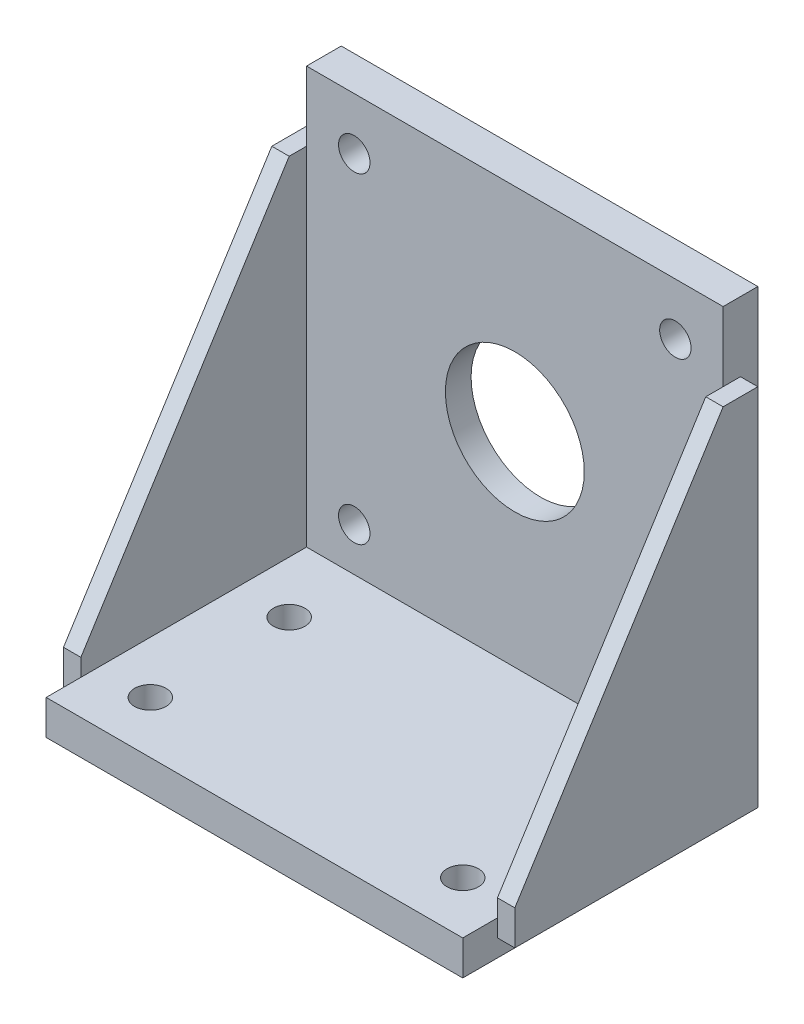
ISO-10303-21;
HEADER;
FILE_DESCRIPTION(('STEP AP214'),'2;1');
FILE_NAME('part.step','',(''),(''),'','','');
FILE_SCHEMA(('AUTOMOTIVE_DESIGN { 1 0 10303 214 1 1 1 1 }'));
ENDSEC;
DATA;
#1=APPLICATION_CONTEXT('core data for automotive mechanical design processes');
#2=APPLICATION_PROTOCOL_DEFINITION('international standard','automotive_design',2000,#1);
#3=PRODUCT_CONTEXT('',#1,'mechanical');
#4=PRODUCT('Part','Part','',(#3));
#5=PRODUCT_RELATED_PRODUCT_CATEGORY('part','',(#4));
#6=PRODUCT_DEFINITION_FORMATION('','',#4);
#7=PRODUCT_DEFINITION_CONTEXT('part definition',#1,'design');
#8=PRODUCT_DEFINITION('design','',#6,#7);
#9=PRODUCT_DEFINITION_SHAPE('','',#8);
#10=(LENGTH_UNIT() NAMED_UNIT(*) SI_UNIT(.MILLI.,.METRE.));
#11=(NAMED_UNIT(*) PLANE_ANGLE_UNIT() SI_UNIT($,.RADIAN.));
#12=(NAMED_UNIT(*) SI_UNIT($,.STERADIAN.) SOLID_ANGLE_UNIT());
#13=UNCERTAINTY_MEASURE_WITH_UNIT(LENGTH_MEASURE(1.E-05),#10,'distance_accuracy_value','');
#14=(GEOMETRIC_REPRESENTATION_CONTEXT(3) GLOBAL_UNCERTAINTY_ASSIGNED_CONTEXT((#13)) GLOBAL_UNIT_ASSIGNED_CONTEXT((#10,
#11,#12)) REPRESENTATION_CONTEXT('',''));
#15=CARTESIAN_POINT('',(0.,0.,0.));
#16=DIRECTION('',(0.,0.,1.));
#17=DIRECTION('',(1.,0.,0.));
#18=AXIS2_PLACEMENT_3D('',#15,#16,#17);
#19=CARTESIAN_POINT('',(-76.2,77.7875,12.7));
#20=DIRECTION('',(1.,0.,0.));
#21=DIRECTION('',(0.,1.,0.));
#22=AXIS2_PLACEMENT_3D('',#19,#20,#21);
#23=PLANE('',#22);
#24=DIRECTION('',(0.,0.,1.));
#25=VECTOR('',#24,1.);
#26=CARTESIAN_POINT('',(-76.2,-74.6125,6.35));
#27=LINE('',#26,#25);
#28=CARTESIAN_POINT('',(-76.2,-74.6125,95.25));
#29=VERTEX_POINT('',#28);
#30=CARTESIAN_POINT('',(-76.2,-74.6125,107.95));
#31=VERTEX_POINT('',#30);
#32=EDGE_CURVE('E297',#29,#31,#27,.T.);
#33=ORIENTED_EDGE('',*,*,#32,.F.);
#34=DIRECTION('',(0.,-1.,0.));
#35=VECTOR('',#34,1.);
#36=CARTESIAN_POINT('',(-76.2,-68.2625,95.25));
#37=LINE('',#36,#35);
#38=CARTESIAN_POINT('',(-76.2,-80.9625,95.25));
#39=VERTEX_POINT('',#38);
#40=EDGE_CURVE('E220',#29,#39,#37,.T.);
#41=ORIENTED_EDGE('',*,*,#40,.T.);
#42=DIRECTION('',(0.,0.,1.));
#43=VECTOR('',#42,1.);
#44=CARTESIAN_POINT('',(-76.2,-80.9625,6.35));
#45=LINE('',#44,#43);
#46=CARTESIAN_POINT('',(-76.2,-80.9625,6.35));
#47=VERTEX_POINT('',#46);
#48=EDGE_CURVE('E210',#47,#39,#45,.T.);
#49=ORIENTED_EDGE('',*,*,#48,.F.);
#50=DIRECTION('',(0.,-1.,0.));
#51=VECTOR('',#50,1.);
#52=CARTESIAN_POINT('',(-76.2,-74.6125,6.35));
#53=LINE('',#52,#51);
#54=CARTESIAN_POINT('',(-76.2,-87.3125,6.35));
#55=VERTEX_POINT('',#54);
#56=EDGE_CURVE('E318',#47,#55,#53,.T.);
#57=ORIENTED_EDGE('',*,*,#56,.T.);
#58=DIRECTION('',(0.,0.,-1.));
#59=VECTOR('',#58,1.);
#60=CARTESIAN_POINT('',(-76.2,-87.3125,107.95));
#61=LINE('',#60,#59);
#62=CARTESIAN_POINT('',(-76.2,-87.3125,107.95));
#63=VERTEX_POINT('',#62);
#64=EDGE_CURVE('E333',#63,#55,#61,.T.);
#65=ORIENTED_EDGE('',*,*,#64,.F.);
#66=DIRECTION('',(0.,1.,0.));
#67=VECTOR('',#66,1.);
#68=CARTESIAN_POINT('',(-76.2,-87.3125,107.95));
#69=LINE('',#68,#67);
#70=EDGE_CURVE('E327',#63,#31,#69,.T.);
#71=ORIENTED_EDGE('',*,*,#70,.T.);
#72=EDGE_LOOP('',(#33,#41,#49,#57,#65,#71));
#73=FACE_BOUND('',#72,.T.);
#74=ADVANCED_FACE('F38',(#73),#23,.F.);
#75=CARTESIAN_POINT('',(76.2,-74.6125,12.7));
#76=DIRECTION('',(-1.,0.,0.));
#77=DIRECTION('',(0.,0.,1.));
#78=AXIS2_PLACEMENT_3D('',#75,#76,#77);
#79=PLANE('',#78);
#80=DIRECTION('',(0.,0.,1.));
#81=VECTOR('',#80,1.);
#82=CARTESIAN_POINT('',(76.2,52.3875,6.35));
#83=LINE('',#82,#81);
#84=CARTESIAN_POINT('',(76.2,52.3875,6.35));
#85=VERTEX_POINT('',#84);
#86=CARTESIAN_POINT('',(76.2,52.3875,12.7));
#87=VERTEX_POINT('',#86);
#88=EDGE_CURVE('E61',#85,#87,#83,.T.);
#89=ORIENTED_EDGE('',*,*,#88,.F.);
#90=DIRECTION('',(0.,1.,0.));
#91=VECTOR('',#90,1.);
#92=CARTESIAN_POINT('',(76.2,-80.9625,6.35));
#93=LINE('',#92,#91);
#94=CARTESIAN_POINT('',(76.2,-74.6125,6.35));
#95=VERTEX_POINT('',#94);
#96=EDGE_CURVE('E221',#95,#85,#93,.T.);
#97=ORIENTED_EDGE('',*,*,#96,.F.);
#98=DIRECTION('',(0.,0.,-1.));
#99=VECTOR('',#98,1.);
#100=CARTESIAN_POINT('',(76.2,-74.6125,12.7));
#101=LINE('',#100,#99);
#102=CARTESIAN_POINT('',(76.2,-74.6125,0.));
#103=VERTEX_POINT('',#102);
#104=EDGE_CURVE('E289',#95,#103,#101,.T.);
#105=ORIENTED_EDGE('',*,*,#104,.T.);
#106=DIRECTION('',(0.,1.,0.));
#107=VECTOR('',#106,1.);
#108=CARTESIAN_POINT('',(76.2,-74.6125,0.));
#109=LINE('',#108,#107);
#110=CARTESIAN_POINT('',(76.2,77.7875,0.));
#111=VERTEX_POINT('',#110);
#112=EDGE_CURVE('E358',#103,#111,#109,.T.);
#113=ORIENTED_EDGE('',*,*,#112,.T.);
#114=DIRECTION('',(0.,0.,-1.));
#115=VECTOR('',#114,1.);
#116=CARTESIAN_POINT('',(76.2,77.7875,12.7));
#117=LINE('',#116,#115);
#118=CARTESIAN_POINT('',(76.2,77.7875,12.7));
#119=VERTEX_POINT('',#118);
#120=EDGE_CURVE('E360',#119,#111,#117,.T.);
#121=ORIENTED_EDGE('',*,*,#120,.F.);
#122=DIRECTION('',(0.,1.,0.));
#123=VECTOR('',#122,1.);
#124=CARTESIAN_POINT('',(76.2,-74.6125,12.7));
#125=LINE('',#124,#123);
#126=EDGE_CURVE('E346',#87,#119,#125,.T.);
#127=ORIENTED_EDGE('',*,*,#126,.F.);
#128=EDGE_LOOP('',(#89,#97,#105,#113,#121,#127));
#129=FACE_BOUND('',#128,.T.);
#130=ADVANCED_FACE('F259',(#129),#79,.F.);
#131=CARTESIAN_POINT('',(76.2,77.7875,12.7));
#132=DIRECTION('',(0.,-1.,0.));
#133=DIRECTION('',(1.,0.,0.));
#134=AXIS2_PLACEMENT_3D('',#131,#132,#133);
#135=PLANE('',#134);
#136=DIRECTION('',(-1.,0.,0.));
#137=VECTOR('',#136,1.);
#138=CARTESIAN_POINT('',(76.2,77.7875,0.));
#139=LINE('',#138,#137);
#140=CARTESIAN_POINT('',(-76.2,77.7875,0.));
#141=VERTEX_POINT('',#140);
#142=EDGE_CURVE('E315',#111,#141,#139,.T.);
#143=ORIENTED_EDGE('',*,*,#142,.T.);
#144=DIRECTION('',(0.,0.,-1.));
#145=VECTOR('',#144,1.);
#146=CARTESIAN_POINT('',(-76.2,77.7875,12.7));
#147=LINE('',#146,#145);
#148=CARTESIAN_POINT('',(-76.2,77.7875,12.7));
#149=VERTEX_POINT('',#148);
#150=EDGE_CURVE('E366',#149,#141,#147,.T.);
#151=ORIENTED_EDGE('',*,*,#150,.F.);
#152=DIRECTION('',(-1.,0.,0.));
#153=VECTOR('',#152,1.);
#154=CARTESIAN_POINT('',(76.2,77.7875,12.7));
#155=LINE('',#154,#153);
#156=EDGE_CURVE('E322',#119,#149,#155,.T.);
#157=ORIENTED_EDGE('',*,*,#156,.F.);
#158=ORIENTED_EDGE('',*,*,#120,.T.);
#159=EDGE_LOOP('',(#143,#151,#157,#158));
#160=FACE_BOUND('',#159,.T.);
#161=ADVANCED_FACE('F266',(#160),#135,.F.);
#162=DIRECTION('',(0.,1.,0.));
#163=VECTOR('',#162,1.);
#164=CARTESIAN_POINT('',(-76.2,-80.9625,6.35));
#165=LINE('',#164,#163);
#166=CARTESIAN_POINT('',(-76.2,-74.6125,6.35));
#167=VERTEX_POINT('',#166);
#168=CARTESIAN_POINT('',(-76.2,52.3875,6.35));
#169=VERTEX_POINT('',#168);
#170=EDGE_CURVE('E217',#167,#169,#165,.T.);
#171=ORIENTED_EDGE('',*,*,#170,.T.);
#172=DIRECTION('',(0.,0.,1.));
#173=VECTOR('',#172,1.);
#174=CARTESIAN_POINT('',(-76.2,52.3875,6.35));
#175=LINE('',#174,#173);
#176=CARTESIAN_POINT('',(-76.2,52.3875,12.7));
#177=VERTEX_POINT('',#176);
#178=EDGE_CURVE('E53',#169,#177,#175,.T.);
#179=ORIENTED_EDGE('',*,*,#178,.T.);
#180=DIRECTION('',(0.,-1.,0.));
#181=VECTOR('',#180,1.);
#182=CARTESIAN_POINT('',(-76.2,77.7875,12.7));
#183=LINE('',#182,#181);
#184=EDGE_CURVE('E339',#149,#177,#183,.T.);
#185=ORIENTED_EDGE('',*,*,#184,.F.);
#186=ORIENTED_EDGE('',*,*,#150,.T.);
#187=DIRECTION('',(0.,-1.,0.));
#188=VECTOR('',#187,1.);
#189=CARTESIAN_POINT('',(-76.2,77.7875,0.));
#190=LINE('',#189,#188);
#191=CARTESIAN_POINT('',(-76.2,-74.6125,0.));
#192=VERTEX_POINT('',#191);
#193=EDGE_CURVE('E353',#141,#192,#190,.T.);
#194=ORIENTED_EDGE('',*,*,#193,.T.);
#195=DIRECTION('',(0.,0.,-1.));
#196=VECTOR('',#195,1.);
#197=CARTESIAN_POINT('',(-76.2,-74.6125,12.7));
#198=LINE('',#197,#196);
#199=EDGE_CURVE('E284',#167,#192,#198,.T.);
#200=ORIENTED_EDGE('',*,*,#199,.F.);
#201=EDGE_LOOP('',(#171,#179,#185,#186,#194,#200));
#202=FACE_BOUND('',#201,.T.);
#203=ADVANCED_FACE('F262',(#202),#23,.F.);
#204=CARTESIAN_POINT('',(76.2,-74.6125,12.7));
#205=DIRECTION('',(0.,-1.,0.));
#206=DIRECTION('',(1.,0.,0.));
#207=AXIS2_PLACEMENT_3D('',#204,#205,#206);
#208=PLANE('',#207);
#209=DIRECTION('',(1.,0.,0.));
#210=VECTOR('',#209,1.);
#211=CARTESIAN_POINT('',(-76.2,-74.6125,6.35));
#212=LINE('',#211,#210);
#213=EDGE_CURVE('E286',#167,#95,#212,.T.);
#214=ORIENTED_EDGE('',*,*,#213,.F.);
#215=ORIENTED_EDGE('',*,*,#199,.T.);
#216=DIRECTION('',(-1.,0.,0.));
#217=VECTOR('',#216,1.);
#218=CARTESIAN_POINT('',(76.2,-74.6125,0.));
#219=LINE('',#218,#217);
#220=EDGE_CURVE('E355',#103,#192,#219,.T.);
#221=ORIENTED_EDGE('',*,*,#220,.F.);
#222=ORIENTED_EDGE('',*,*,#104,.F.);
#223=EDGE_LOOP('',(#214,#215,#221,#222));
#224=FACE_BOUND('',#223,.T.);
#225=ADVANCED_FACE('F273',(#224),#208,.T.);
#226=DIRECTION('',(0.,-1.,0.));
#227=VECTOR('',#226,1.);
#228=CARTESIAN_POINT('',(76.2,-74.6125,6.35));
#229=LINE('',#228,#227);
#230=CARTESIAN_POINT('',(76.2,-80.9625,6.35));
#231=VERTEX_POINT('',#230);
#232=CARTESIAN_POINT('',(76.2,-87.3125,6.35));
#233=VERTEX_POINT('',#232);
#234=EDGE_CURVE('E827',#231,#233,#229,.T.);
#235=ORIENTED_EDGE('',*,*,#234,.F.);
#236=DIRECTION('',(0.,0.,1.));
#237=VECTOR('',#236,1.);
#238=CARTESIAN_POINT('',(76.2,-80.9625,6.35));
#239=LINE('',#238,#237);
#240=CARTESIAN_POINT('',(76.2,-80.9625,95.25));
#241=VERTEX_POINT('',#240);
#242=EDGE_CURVE('E334',#231,#241,#239,.T.);
#243=ORIENTED_EDGE('',*,*,#242,.T.);
#244=DIRECTION('',(0.,-1.,0.));
#245=VECTOR('',#244,1.);
#246=CARTESIAN_POINT('',(76.2,-68.2625,95.25));
#247=LINE('',#246,#245);
#248=CARTESIAN_POINT('',(76.2,-74.6125,95.25));
#249=VERTEX_POINT('',#248);
#250=EDGE_CURVE('E368',#249,#241,#247,.T.);
#251=ORIENTED_EDGE('',*,*,#250,.F.);
#252=DIRECTION('',(0.,0.,1.));
#253=VECTOR('',#252,1.);
#254=CARTESIAN_POINT('',(76.2,-74.6125,6.35));
#255=LINE('',#254,#253);
#256=CARTESIAN_POINT('',(76.2,-74.6125,107.95));
#257=VERTEX_POINT('',#256);
#258=EDGE_CURVE('E319',#249,#257,#255,.T.);
#259=ORIENTED_EDGE('',*,*,#258,.T.);
#260=DIRECTION('',(0.,1.,0.));
#261=VECTOR('',#260,1.);
#262=CARTESIAN_POINT('',(76.2,-87.3125,107.95));
#263=LINE('',#262,#261);
#264=CARTESIAN_POINT('',(76.2,-87.3125,107.95));
#265=VERTEX_POINT('',#264);
#266=EDGE_CURVE('E835',#265,#257,#263,.T.);
#267=ORIENTED_EDGE('',*,*,#266,.F.);
#268=DIRECTION('',(0.,0.,-1.));
#269=VECTOR('',#268,1.);
#270=CARTESIAN_POINT('',(76.2,-87.3125,107.95));
#271=LINE('',#270,#269);
#272=EDGE_CURVE('E329',#265,#233,#271,.T.);
#273=ORIENTED_EDGE('',*,*,#272,.T.);
#274=EDGE_LOOP('',(#235,#243,#251,#259,#267,#273));
#275=FACE_BOUND('',#274,.T.);
#276=ADVANCED_FACE('F268',(#275),#79,.F.);
#277=CARTESIAN_POINT('',(-76.2,77.7875,12.7));
#278=DIRECTION('',(0.,0.,1.));
#279=DIRECTION('',(1.,0.,0.));
#280=AXIS2_PLACEMENT_3D('',#277,#278,#279);
#281=PLANE('',#280);
#282=CARTESIAN_POINT('',(58.7375,-58.7375,12.7));
#283=DIRECTION('',(0.,0.,1.));
#284=DIRECTION('',(1.,0.,0.));
#285=AXIS2_PLACEMENT_3D('',#282,#283,#284);
#286=CIRCLE('',#285,5.75436999999999);
#287=CARTESIAN_POINT('',(64.49187,-58.7375,12.7));
#288=VERTEX_POINT('',#287);
#289=EDGE_CURVE('E455',#288,#288,#286,.T.);
#290=ORIENTED_EDGE('',*,*,#289,.F.);
#291=EDGE_LOOP('',(#290));
#292=FACE_BOUND('',#291,.T.);
#293=CARTESIAN_POINT('',(58.7375,58.7375,12.7));
#294=DIRECTION('',(0.,0.,1.));
#295=DIRECTION('',(1.,0.,0.));
#296=AXIS2_PLACEMENT_3D('',#293,#294,#295);
#297=CIRCLE('',#296,5.75436999999999);
#298=CARTESIAN_POINT('',(64.49187,58.7375,12.7));
#299=VERTEX_POINT('',#298);
#300=EDGE_CURVE('E449',#299,#299,#297,.T.);
#301=ORIENTED_EDGE('',*,*,#300,.F.);
#302=EDGE_LOOP('',(#301));
#303=FACE_BOUND('',#302,.T.);
#304=CARTESIAN_POINT('',(-58.7375,58.7375,12.7));
#305=DIRECTION('',(0.,0.,1.));
#306=DIRECTION('',(1.,0.,0.));
#307=AXIS2_PLACEMENT_3D('',#304,#305,#306);
#308=CIRCLE('',#307,5.75436999999999);
#309=CARTESIAN_POINT('',(-52.98313,58.7375,12.7));
#310=VERTEX_POINT('',#309);
#311=EDGE_CURVE('E443',#310,#310,#308,.T.);
#312=ORIENTED_EDGE('',*,*,#311,.F.);
#313=EDGE_LOOP('',(#312));
#314=FACE_BOUND('',#313,.T.);
#315=CARTESIAN_POINT('',(-58.7375,-58.7375,12.7));
#316=DIRECTION('',(0.,0.,1.));
#317=DIRECTION('',(1.,0.,0.));
#318=AXIS2_PLACEMENT_3D('',#315,#316,#317);
#319=CIRCLE('',#318,5.75436999999999);
#320=CARTESIAN_POINT('',(-52.98313,-58.7375,12.7));
#321=VERTEX_POINT('',#320);
#322=EDGE_CURVE('E437',#321,#321,#319,.T.);
#323=ORIENTED_EDGE('',*,*,#322,.F.);
#324=EDGE_LOOP('',(#323));
#325=FACE_BOUND('',#324,.T.);
#326=CARTESIAN_POINT('',(0.,0.,12.7));
#327=DIRECTION('',(0.,0.,1.));
#328=DIRECTION('',(1.,0.,0.));
#329=AXIS2_PLACEMENT_3D('',#326,#327,#328);
#330=CIRCLE('',#329,25.4);
#331=CARTESIAN_POINT('',(25.4,0.,12.7));
#332=VERTEX_POINT('',#331);
#333=EDGE_CURVE('E427',#332,#332,#330,.T.);
#334=ORIENTED_EDGE('',*,*,#333,.F.);
#335=EDGE_LOOP('',(#334));
#336=FACE_BOUND('',#335,.T.);
#337=ORIENTED_EDGE('',*,*,#156,.T.);
#338=ORIENTED_EDGE('',*,*,#184,.T.);
#339=CARTESIAN_POINT('',(-76.2,-74.6124999999999,12.7));
#340=VERTEX_POINT('',#339);
#341=EDGE_CURVE('E222',#177,#340,#183,.T.);
#342=ORIENTED_EDGE('',*,*,#341,.T.);
#343=DIRECTION('',(-1.,0.,0.));
#344=VECTOR('',#343,1.);
#345=CARTESIAN_POINT('',(76.2,-74.6125,12.7));
#346=LINE('',#345,#344);
#347=CARTESIAN_POINT('',(76.2,-74.6125,12.7));
#348=VERTEX_POINT('',#347);
#349=EDGE_CURVE('E340',#348,#340,#346,.T.);
#350=ORIENTED_EDGE('',*,*,#349,.F.);
#351=EDGE_CURVE('E347',#348,#87,#125,.T.);
#352=ORIENTED_EDGE('',*,*,#351,.T.);
#353=ORIENTED_EDGE('',*,*,#126,.T.);
#354=EDGE_LOOP('',(#337,#338,#342,#350,#352,#353));
#355=FACE_BOUND('',#354,.T.);
#356=ADVANCED_FACE('F681',(#292,#303,#314,#325,#336,#355),#281,.T.);
#357=CARTESIAN_POINT('',(-76.2,77.7875,0.));
#358=DIRECTION('',(0.,0.,1.));
#359=DIRECTION('',(1.,0.,0.));
#360=AXIS2_PLACEMENT_3D('',#357,#358,#359);
#361=PLANE('',#360);
#362=CARTESIAN_POINT('',(58.7375,-58.7375,0.));
#363=DIRECTION('',(0.,0.,1.));
#364=DIRECTION('',(1.,0.,0.));
#365=AXIS2_PLACEMENT_3D('',#362,#363,#364);
#366=CIRCLE('',#365,5.75436999999999);
#367=CARTESIAN_POINT('',(64.49187,-58.7375,0.));
#368=VERTEX_POINT('',#367);
#369=EDGE_CURVE('E452',#368,#368,#366,.T.);
#370=ORIENTED_EDGE('',*,*,#369,.T.);
#371=EDGE_LOOP('',(#370));
#372=FACE_BOUND('',#371,.T.);
#373=CARTESIAN_POINT('',(58.7375,58.7375,0.));
#374=DIRECTION('',(0.,0.,1.));
#375=DIRECTION('',(1.,0.,0.));
#376=AXIS2_PLACEMENT_3D('',#373,#374,#375);
#377=CIRCLE('',#376,5.75436999999999);
#378=CARTESIAN_POINT('',(64.49187,58.7375,0.));
#379=VERTEX_POINT('',#378);
#380=EDGE_CURVE('E446',#379,#379,#377,.T.);
#381=ORIENTED_EDGE('',*,*,#380,.T.);
#382=EDGE_LOOP('',(#381));
#383=FACE_BOUND('',#382,.T.);
#384=CARTESIAN_POINT('',(-58.7375,58.7375,0.));
#385=DIRECTION('',(0.,0.,1.));
#386=DIRECTION('',(1.,0.,0.));
#387=AXIS2_PLACEMENT_3D('',#384,#385,#386);
#388=CIRCLE('',#387,5.75436999999999);
#389=CARTESIAN_POINT('',(-52.98313,58.7375,0.));
#390=VERTEX_POINT('',#389);
#391=EDGE_CURVE('E440',#390,#390,#388,.T.);
#392=ORIENTED_EDGE('',*,*,#391,.T.);
#393=EDGE_LOOP('',(#392));
#394=FACE_BOUND('',#393,.T.);
#395=CARTESIAN_POINT('',(-58.7375,-58.7375,0.));
#396=DIRECTION('',(0.,0.,1.));
#397=DIRECTION('',(1.,0.,0.));
#398=AXIS2_PLACEMENT_3D('',#395,#396,#397);
#399=CIRCLE('',#398,5.75436999999999);
#400=CARTESIAN_POINT('',(-52.98313,-58.7375,0.));
#401=VERTEX_POINT('',#400);
#402=EDGE_CURVE('E434',#401,#401,#399,.T.);
#403=ORIENTED_EDGE('',*,*,#402,.T.);
#404=EDGE_LOOP('',(#403));
#405=FACE_BOUND('',#404,.T.);
#406=CARTESIAN_POINT('',(0.,0.,0.));
#407=DIRECTION('',(0.,0.,-1.));
#408=DIRECTION('',(-1.,0.,0.));
#409=AXIS2_PLACEMENT_3D('',#406,#407,#408);
#410=CIRCLE('',#409,63.5635);
#411=CARTESIAN_POINT('',(-63.5635,0.,0.));
#412=VERTEX_POINT('',#411);
#413=EDGE_CURVE('E422',#412,#412,#410,.T.);
#414=ORIENTED_EDGE('',*,*,#413,.F.);
#415=EDGE_LOOP('',(#414));
#416=FACE_BOUND('',#415,.T.);
#417=ORIENTED_EDGE('',*,*,#142,.F.);
#418=ORIENTED_EDGE('',*,*,#112,.F.);
#419=ORIENTED_EDGE('',*,*,#220,.T.);
#420=ORIENTED_EDGE('',*,*,#193,.F.);
#421=EDGE_LOOP('',(#417,#418,#419,#420));
#422=FACE_BOUND('',#421,.T.);
#423=ADVANCED_FACE('F254',(#372,#383,#394,#405,#416,#422),#361,.F.);
#424=CARTESIAN_POINT('',(-76.2,-74.6125,6.35));
#425=DIRECTION('',(0.,0.,1.));
#426=DIRECTION('',(0.,-1.,0.));
#427=AXIS2_PLACEMENT_3D('',#424,#425,#426);
#428=PLANE('',#427);
#429=ORIENTED_EDGE('',*,*,#213,.T.);
#430=ORIENTED_EDGE('',*,*,#96,.T.);
#431=DIRECTION('',(-1.,0.,0.));
#432=VECTOR('',#431,1.);
#433=CARTESIAN_POINT('',(82.55,52.3875,6.35));
#434=LINE('',#433,#432);
#435=CARTESIAN_POINT('',(82.55,52.3875,6.35));
#436=VERTEX_POINT('',#435);
#437=EDGE_CURVE('E391',#436,#85,#434,.T.);
#438=ORIENTED_EDGE('',*,*,#437,.F.);
#439=DIRECTION('',(0.,1.,0.));
#440=VECTOR('',#439,1.);
#441=CARTESIAN_POINT('',(82.55,-80.9625,6.35));
#442=LINE('',#441,#440);
#443=CARTESIAN_POINT('',(82.55,-80.9625,6.35));
#444=VERTEX_POINT('',#443);
#445=EDGE_CURVE('E389',#444,#436,#442,.T.);
#446=ORIENTED_EDGE('',*,*,#445,.F.);
#447=DIRECTION('',(-1.,0.,0.));
#448=VECTOR('',#447,1.);
#449=CARTESIAN_POINT('',(82.55,-80.9625,6.35));
#450=LINE('',#449,#448);
#451=EDGE_CURVE('E815',#444,#231,#450,.T.);
#452=ORIENTED_EDGE('',*,*,#451,.T.);
#453=ORIENTED_EDGE('',*,*,#234,.T.);
#454=DIRECTION('',(1.,0.,0.));
#455=VECTOR('',#454,1.);
#456=CARTESIAN_POINT('',(-76.2,-87.3125,6.35));
#457=LINE('',#456,#455);
#458=EDGE_CURVE('E312',#55,#233,#457,.T.);
#459=ORIENTED_EDGE('',*,*,#458,.F.);
#460=ORIENTED_EDGE('',*,*,#56,.F.);
#461=DIRECTION('',(1.,0.,0.));
#462=VECTOR('',#461,1.);
#463=CARTESIAN_POINT('',(-82.55,-80.9625,6.35));
#464=LINE('',#463,#462);
#465=CARTESIAN_POINT('',(-82.55,-80.9625,6.35));
#466=VERTEX_POINT('',#465);
#467=EDGE_CURVE('E184',#466,#47,#464,.T.);
#468=ORIENTED_EDGE('',*,*,#467,.F.);
#469=DIRECTION('',(0.,1.,0.));
#470=VECTOR('',#469,1.);
#471=CARTESIAN_POINT('',(-82.55,-80.9625,6.35));
#472=LINE('',#471,#470);
#473=CARTESIAN_POINT('',(-82.55,52.3875,6.35));
#474=VERTEX_POINT('',#473);
#475=EDGE_CURVE('E189',#466,#474,#472,.T.);
#476=ORIENTED_EDGE('',*,*,#475,.T.);
#477=DIRECTION('',(1.,0.,0.));
#478=VECTOR('',#477,1.);
#479=CARTESIAN_POINT('',(-82.55,52.3875,6.35));
#480=LINE('',#479,#478);
#481=EDGE_CURVE('E174',#474,#169,#480,.T.);
#482=ORIENTED_EDGE('',*,*,#481,.T.);
#483=ORIENTED_EDGE('',*,*,#170,.F.);
#484=EDGE_LOOP('',(#429,#430,#438,#446,#452,#453,#459,#460,#468,#476,#482,#483));
#485=FACE_BOUND('',#484,.T.);
#486=ADVANCED_FACE('F196',(#485),#428,.F.);
#487=CARTESIAN_POINT('',(-76.2,-87.3125,107.95));
#488=DIRECTION('',(0.,-1.,0.));
#489=DIRECTION('',(0.,0.,-1.));
#490=AXIS2_PLACEMENT_3D('',#487,#488,#489);
#491=PLANE('',#490);
#492=CARTESIAN_POINT('',(57.15,-87.3125,88.9));
#493=DIRECTION('',(0.,-1.,0.));
#494=DIRECTION('',(0.,0.,-1.));
#495=AXIS2_PLACEMENT_3D('',#492,#493,#494);
#496=CIRCLE('',#495,5.75436999999999);
#497=CARTESIAN_POINT('',(57.15,-87.3125,83.14563));
#498=VERTEX_POINT('',#497);
#499=EDGE_CURVE('E467',#498,#498,#496,.T.);
#500=ORIENTED_EDGE('',*,*,#499,.F.);
#501=EDGE_LOOP('',(#500));
#502=FACE_BOUND('',#501,.T.);
#503=CARTESIAN_POINT('',(-57.15,-87.3125,88.9));
#504=DIRECTION('',(0.,-1.,0.));
#505=DIRECTION('',(0.,0.,-1.));
#506=AXIS2_PLACEMENT_3D('',#503,#504,#505);
#507=CIRCLE('',#506,5.75436999999999);
#508=CARTESIAN_POINT('',(-57.15,-87.3125,83.14563));
#509=VERTEX_POINT('',#508);
#510=EDGE_CURVE('E458',#509,#509,#507,.T.);
#511=ORIENTED_EDGE('',*,*,#510,.F.);
#512=EDGE_LOOP('',(#511));
#513=FACE_BOUND('',#512,.T.);
#514=ORIENTED_EDGE('',*,*,#272,.F.);
#515=DIRECTION('',(1.,0.,0.));
#516=VECTOR('',#515,1.);
#517=CARTESIAN_POINT('',(-76.2,-87.3125,107.95));
#518=LINE('',#517,#516);
#519=EDGE_CURVE('E294',#63,#265,#518,.T.);
#520=ORIENTED_EDGE('',*,*,#519,.F.);
#521=ORIENTED_EDGE('',*,*,#64,.T.);
#522=ORIENTED_EDGE('',*,*,#458,.T.);
#523=EDGE_LOOP('',(#514,#520,#521,#522));
#524=FACE_BOUND('',#523,.T.);
#525=CARTESIAN_POINT('',(-57.15,-87.3125,38.1));
#526=DIRECTION('',(0.,-1.,0.));
#527=DIRECTION('',(0.,0.,-1.));
#528=AXIS2_PLACEMENT_3D('',#525,#526,#527);
#529=CIRCLE('',#528,5.75436999999999);
#530=CARTESIAN_POINT('',(-57.15,-87.3125,32.34563));
#531=VERTEX_POINT('',#530);
#532=EDGE_CURVE('E232',#531,#531,#529,.T.);
#533=ORIENTED_EDGE('',*,*,#532,.F.);
#534=EDGE_LOOP('',(#533));
#535=FACE_BOUND('',#534,.T.);
#536=CARTESIAN_POINT('',(57.1499999999999,-87.3125,38.1));
#537=DIRECTION('',(0.,-1.,0.));
#538=DIRECTION('',(0.,0.,-1.));
#539=AXIS2_PLACEMENT_3D('',#536,#537,#538);
#540=CIRCLE('',#539,5.75436999999999);
#541=CARTESIAN_POINT('',(57.1499999999999,-87.3125,32.34563));
#542=VERTEX_POINT('',#541);
#543=EDGE_CURVE('E46',#542,#542,#540,.T.);
#544=ORIENTED_EDGE('',*,*,#543,.F.);
#545=EDGE_LOOP('',(#544));
#546=FACE_BOUND('',#545,.T.);
#547=ADVANCED_FACE('F242',(#502,#513,#524,#535,#546),#491,.T.);
#548=CARTESIAN_POINT('',(-76.2,-87.3125,107.95));
#549=DIRECTION('',(0.,0.,-1.));
#550=DIRECTION('',(-1.,0.,0.));
#551=AXIS2_PLACEMENT_3D('',#548,#549,#550);
#552=PLANE('',#551);
#553=ORIENTED_EDGE('',*,*,#266,.T.);
#554=DIRECTION('',(1.,0.,0.));
#555=VECTOR('',#554,1.);
#556=CARTESIAN_POINT('',(-76.2,-74.6125,107.95));
#557=LINE('',#556,#555);
#558=EDGE_CURVE('E290',#31,#257,#557,.T.);
#559=ORIENTED_EDGE('',*,*,#558,.F.);
#560=ORIENTED_EDGE('',*,*,#70,.F.);
#561=ORIENTED_EDGE('',*,*,#519,.T.);
#562=EDGE_LOOP('',(#553,#559,#560,#561));
#563=FACE_BOUND('',#562,.T.);
#564=ADVANCED_FACE('F244',(#563),#552,.F.);
#565=CARTESIAN_POINT('',(-76.2,-74.6125,6.35));
#566=DIRECTION('',(0.,1.,0.));
#567=DIRECTION('',(0.,0.,1.));
#568=AXIS2_PLACEMENT_3D('',#565,#566,#567);
#569=PLANE('',#568);
#570=CARTESIAN_POINT('',(57.15,-74.6125,88.9));
#571=DIRECTION('',(0.,1.,0.));
#572=DIRECTION('',(0.,0.,1.));
#573=AXIS2_PLACEMENT_3D('',#570,#571,#572);
#574=CIRCLE('',#573,5.75436999999999);
#575=CARTESIAN_POINT('',(57.15,-74.6125,94.65437));
#576=VERTEX_POINT('',#575);
#577=EDGE_CURVE('E464',#576,#576,#574,.T.);
#578=ORIENTED_EDGE('',*,*,#577,.F.);
#579=EDGE_LOOP('',(#578));
#580=FACE_BOUND('',#579,.T.);
#581=CARTESIAN_POINT('',(-57.15,-74.6125,88.9));
#582=DIRECTION('',(0.,1.,0.));
#583=DIRECTION('',(0.,0.,1.));
#584=AXIS2_PLACEMENT_3D('',#581,#582,#583);
#585=CIRCLE('',#584,5.75436999999999);
#586=CARTESIAN_POINT('',(-57.15,-74.6125,94.65437));
#587=VERTEX_POINT('',#586);
#588=EDGE_CURVE('E461',#587,#587,#585,.T.);
#589=ORIENTED_EDGE('',*,*,#588,.F.);
#590=EDGE_LOOP('',(#589));
#591=FACE_BOUND('',#590,.T.);
#592=EDGE_CURVE('E316',#348,#249,#255,.T.);
#593=ORIENTED_EDGE('',*,*,#592,.F.);
#594=ORIENTED_EDGE('',*,*,#349,.T.);
#595=EDGE_CURVE('E291',#340,#29,#27,.T.);
#596=ORIENTED_EDGE('',*,*,#595,.T.);
#597=ORIENTED_EDGE('',*,*,#32,.T.);
#598=ORIENTED_EDGE('',*,*,#558,.T.);
#599=ORIENTED_EDGE('',*,*,#258,.F.);
#600=EDGE_LOOP('',(#593,#594,#596,#597,#598,#599));
#601=FACE_BOUND('',#600,.T.);
#602=CARTESIAN_POINT('',(-57.15,-74.6124999999999,38.1));
#603=DIRECTION('',(0.,1.,0.));
#604=DIRECTION('',(0.,0.,1.));
#605=AXIS2_PLACEMENT_3D('',#602,#603,#604);
#606=CIRCLE('',#605,5.75436999999999);
#607=CARTESIAN_POINT('',(-57.15,-74.6124999999999,43.85437));
#608=VERTEX_POINT('',#607);
#609=EDGE_CURVE('E235',#608,#608,#606,.T.);
#610=ORIENTED_EDGE('',*,*,#609,.F.);
#611=EDGE_LOOP('',(#610));
#612=FACE_BOUND('',#611,.T.);
#613=CARTESIAN_POINT('',(57.1499999999999,-74.6124999999999,38.1));
#614=DIRECTION('',(0.,1.,0.));
#615=DIRECTION('',(0.,0.,1.));
#616=AXIS2_PLACEMENT_3D('',#613,#614,#615);
#617=CIRCLE('',#616,5.75436999999999);
#618=CARTESIAN_POINT('',(57.1499999999999,-74.6124999999999,43.85437));
#619=VERTEX_POINT('',#618);
#620=EDGE_CURVE('E11',#619,#619,#617,.T.);
#621=ORIENTED_EDGE('',*,*,#620,.F.);
#622=EDGE_LOOP('',(#621));
#623=FACE_BOUND('',#622,.T.);
#624=ADVANCED_FACE('F251',(#580,#591,#601,#612,#623),#569,.T.);
#625=CARTESIAN_POINT('',(82.55,52.3875,6.35));
#626=DIRECTION('',(0.,-1.,0.));
#627=DIRECTION('',(0.,0.,-1.));
#628=AXIS2_PLACEMENT_3D('',#625,#626,#627);
#629=PLANE('',#628);
#630=ORIENTED_EDGE('',*,*,#88,.T.);
#631=CARTESIAN_POINT('',(76.2,52.3875,19.05));
#632=VERTEX_POINT('',#631);
#633=EDGE_CURVE('E183',#87,#632,#83,.T.);
#634=ORIENTED_EDGE('',*,*,#633,.T.);
#635=DIRECTION('',(-1.,0.,0.));
#636=VECTOR('',#635,1.);
#637=CARTESIAN_POINT('',(82.55,52.3875,19.05));
#638=LINE('',#637,#636);
#639=CARTESIAN_POINT('',(82.55,52.3875,19.05));
#640=VERTEX_POINT('',#639);
#641=EDGE_CURVE('E826',#640,#632,#638,.T.);
#642=ORIENTED_EDGE('',*,*,#641,.F.);
#643=DIRECTION('',(0.,0.,1.));
#644=VECTOR('',#643,1.);
#645=CARTESIAN_POINT('',(82.55,52.3875,6.35));
#646=LINE('',#645,#644);
#647=EDGE_CURVE('E382',#436,#640,#646,.T.);
#648=ORIENTED_EDGE('',*,*,#647,.F.);
#649=ORIENTED_EDGE('',*,*,#437,.T.);
#650=EDGE_LOOP('',(#630,#634,#642,#648,#649));
#651=FACE_BOUND('',#650,.T.);
#652=ADVANCED_FACE('F480',(#651),#629,.F.);
#653=CARTESIAN_POINT('',(82.55,52.3875,19.05));
#654=DIRECTION('',(0.,-0.533992991387982,-0.845488903030971));
#655=DIRECTION('',(0.,0.845488903030971,-0.533992991387982));
#656=AXIS2_PLACEMENT_3D('',#653,#654,#655);
#657=PLANE('',#656);
#658=DIRECTION('',(0.,-0.845488903030971,0.533992991387982));
#659=VECTOR('',#658,1.);
#660=CARTESIAN_POINT('',(76.2,52.3875,19.05));
#661=LINE('',#660,#659);
#662=CARTESIAN_POINT('',(76.2,-68.2625,95.25));
#663=VERTEX_POINT('',#662);
#664=EDGE_CURVE('E379',#632,#663,#661,.T.);
#665=ORIENTED_EDGE('',*,*,#664,.T.);
#666=DIRECTION('',(-1.,0.,0.));
#667=VECTOR('',#666,1.);
#668=CARTESIAN_POINT('',(82.55,-68.2625,95.25));
#669=LINE('',#668,#667);
#670=CARTESIAN_POINT('',(82.55,-68.2625,95.25));
#671=VERTEX_POINT('',#670);
#672=EDGE_CURVE('E824',#671,#663,#669,.T.);
#673=ORIENTED_EDGE('',*,*,#672,.F.);
#674=DIRECTION('',(0.,-0.845488903030971,0.533992991387982));
#675=VECTOR('',#674,1.);
#676=CARTESIAN_POINT('',(82.55,52.3875,19.05));
#677=LINE('',#676,#675);
#678=EDGE_CURVE('E397',#640,#671,#677,.T.);
#679=ORIENTED_EDGE('',*,*,#678,.F.);
#680=ORIENTED_EDGE('',*,*,#641,.T.);
#681=EDGE_LOOP('',(#665,#673,#679,#680));
#682=FACE_BOUND('',#681,.T.);
#683=ADVANCED_FACE('F640',(#682),#657,.F.);
#684=CARTESIAN_POINT('',(82.55,-68.2625,95.25));
#685=DIRECTION('',(0.,0.,-1.));
#686=DIRECTION('',(-1.,0.,0.));
#687=AXIS2_PLACEMENT_3D('',#684,#685,#686);
#688=PLANE('',#687);
#689=EDGE_CURVE('E372',#663,#249,#247,.T.);
#690=ORIENTED_EDGE('',*,*,#689,.T.);
#691=ORIENTED_EDGE('',*,*,#250,.T.);
#692=DIRECTION('',(-1.,0.,0.));
#693=VECTOR('',#692,1.);
#694=CARTESIAN_POINT('',(82.55,-80.9625,95.25));
#695=LINE('',#694,#693);
#696=CARTESIAN_POINT('',(82.55,-80.9625,95.25));
#697=VERTEX_POINT('',#696);
#698=EDGE_CURVE('E818',#697,#241,#695,.T.);
#699=ORIENTED_EDGE('',*,*,#698,.F.);
#700=DIRECTION('',(0.,-1.,0.));
#701=VECTOR('',#700,1.);
#702=CARTESIAN_POINT('',(82.55,-68.2625,95.25));
#703=LINE('',#702,#701);
#704=EDGE_CURVE('E395',#671,#697,#703,.T.);
#705=ORIENTED_EDGE('',*,*,#704,.F.);
#706=ORIENTED_EDGE('',*,*,#672,.T.);
#707=EDGE_LOOP('',(#690,#691,#699,#705,#706));
#708=FACE_BOUND('',#707,.T.);
#709=ADVANCED_FACE('F632',(#708),#688,.F.);
#710=CARTESIAN_POINT('',(82.55,-80.9625,6.35));
#711=DIRECTION('',(0.,-1.,0.));
#712=DIRECTION('',(0.,0.,-1.));
#713=AXIS2_PLACEMENT_3D('',#710,#711,#712);
#714=PLANE('',#713);
#715=ORIENTED_EDGE('',*,*,#242,.F.);
#716=ORIENTED_EDGE('',*,*,#451,.F.);
#717=DIRECTION('',(0.,0.,1.));
#718=VECTOR('',#717,1.);
#719=CARTESIAN_POINT('',(82.55,-80.9625,6.35));
#720=LINE('',#719,#718);
#721=EDGE_CURVE('E392',#444,#697,#720,.T.);
#722=ORIENTED_EDGE('',*,*,#721,.T.);
#723=ORIENTED_EDGE('',*,*,#698,.T.);
#724=EDGE_LOOP('',(#715,#716,#722,#723));
#725=FACE_BOUND('',#724,.T.);
#726=ADVANCED_FACE('F624',(#725),#714,.T.);
#727=CARTESIAN_POINT('',(82.55,52.3875,95.25));
#728=DIRECTION('',(1.,0.,0.));
#729=DIRECTION('',(0.,0.,-1.));
#730=AXIS2_PLACEMENT_3D('',#727,#728,#729);
#731=PLANE('',#730);
#732=ORIENTED_EDGE('',*,*,#647,.T.);
#733=ORIENTED_EDGE('',*,*,#678,.T.);
#734=ORIENTED_EDGE('',*,*,#704,.T.);
#735=ORIENTED_EDGE('',*,*,#721,.F.);
#736=ORIENTED_EDGE('',*,*,#445,.T.);
#737=EDGE_LOOP('',(#732,#733,#734,#735,#736));
#738=FACE_BOUND('',#737,.T.);
#739=ADVANCED_FACE('F616',(#738),#731,.T.);
#740=CARTESIAN_POINT('',(76.2,52.3875,95.25));
#741=DIRECTION('',(1.,0.,0.));
#742=DIRECTION('',(0.,0.,-1.));
#743=AXIS2_PLACEMENT_3D('',#740,#741,#742);
#744=PLANE('',#743);
#745=ORIENTED_EDGE('',*,*,#351,.F.);
#746=ORIENTED_EDGE('',*,*,#592,.T.);
#747=ORIENTED_EDGE('',*,*,#689,.F.);
#748=ORIENTED_EDGE('',*,*,#664,.F.);
#749=ORIENTED_EDGE('',*,*,#633,.F.);
#750=EDGE_LOOP('',(#745,#746,#747,#748,#749));
#751=FACE_BOUND('',#750,.T.);
#752=ADVANCED_FACE('F608',(#751),#744,.F.);
#753=CARTESIAN_POINT('',(-82.55,52.3875,6.35));
#754=DIRECTION('',(0.,1.,0.));
#755=DIRECTION('',(0.,0.,1.));
#756=AXIS2_PLACEMENT_3D('',#753,#754,#755);
#757=PLANE('',#756);
#758=ORIENTED_EDGE('',*,*,#178,.F.);
#759=ORIENTED_EDGE('',*,*,#481,.F.);
#760=DIRECTION('',(0.,0.,1.));
#761=VECTOR('',#760,1.);
#762=CARTESIAN_POINT('',(-82.55,52.3875,6.35));
#763=LINE('',#762,#761);
#764=CARTESIAN_POINT('',(-82.55,52.3875,19.05));
#765=VERTEX_POINT('',#764);
#766=EDGE_CURVE('E178',#474,#765,#763,.T.);
#767=ORIENTED_EDGE('',*,*,#766,.T.);
#768=DIRECTION('',(1.,0.,0.));
#769=VECTOR('',#768,1.);
#770=CARTESIAN_POINT('',(-82.55,52.3875,19.05));
#771=LINE('',#770,#769);
#772=CARTESIAN_POINT('',(-76.2,52.3875,19.05));
#773=VERTEX_POINT('',#772);
#774=EDGE_CURVE('E208',#765,#773,#771,.T.);
#775=ORIENTED_EDGE('',*,*,#774,.T.);
#776=EDGE_CURVE('E211',#177,#773,#175,.T.);
#777=ORIENTED_EDGE('',*,*,#776,.F.);
#778=EDGE_LOOP('',(#758,#759,#767,#775,#777));
#779=FACE_BOUND('',#778,.T.);
#780=ADVANCED_FACE('F176',(#779),#757,.T.);
#781=CARTESIAN_POINT('',(-82.55,-80.9625,6.35));
#782=DIRECTION('',(0.,1.,0.));
#783=DIRECTION('',(0.,0.,1.));
#784=AXIS2_PLACEMENT_3D('',#781,#782,#783);
#785=PLANE('',#784);
#786=ORIENTED_EDGE('',*,*,#48,.T.);
#787=DIRECTION('',(1.,0.,0.));
#788=VECTOR('',#787,1.);
#789=CARTESIAN_POINT('',(-82.55,-80.9625,95.25));
#790=LINE('',#789,#788);
#791=CARTESIAN_POINT('',(-82.55,-80.9625,95.25));
#792=VERTEX_POINT('',#791);
#793=EDGE_CURVE('E226',#792,#39,#790,.T.);
#794=ORIENTED_EDGE('',*,*,#793,.F.);
#795=DIRECTION('',(0.,0.,1.));
#796=VECTOR('',#795,1.);
#797=CARTESIAN_POINT('',(-82.55,-80.9625,6.35));
#798=LINE('',#797,#796);
#799=EDGE_CURVE('E199',#466,#792,#798,.T.);
#800=ORIENTED_EDGE('',*,*,#799,.F.);
#801=ORIENTED_EDGE('',*,*,#467,.T.);
#802=EDGE_LOOP('',(#786,#794,#800,#801));
#803=FACE_BOUND('',#802,.T.);
#804=ADVANCED_FACE('F416',(#803),#785,.F.);
#805=CARTESIAN_POINT('',(-82.55,-68.2625,95.25));
#806=DIRECTION('',(0.,0.,1.));
#807=DIRECTION('',(1.,0.,0.));
#808=AXIS2_PLACEMENT_3D('',#805,#806,#807);
#809=PLANE('',#808);
#810=CARTESIAN_POINT('',(-76.2,-68.2625,95.25));
#811=VERTEX_POINT('',#810);
#812=EDGE_CURVE('E231',#811,#29,#37,.T.);
#813=ORIENTED_EDGE('',*,*,#812,.F.);
#814=DIRECTION('',(1.,0.,0.));
#815=VECTOR('',#814,1.);
#816=CARTESIAN_POINT('',(-82.55,-68.2625,95.25));
#817=LINE('',#816,#815);
#818=CARTESIAN_POINT('',(-82.55,-68.2625,95.25));
#819=VERTEX_POINT('',#818);
#820=EDGE_CURVE('E402',#819,#811,#817,.T.);
#821=ORIENTED_EDGE('',*,*,#820,.F.);
#822=DIRECTION('',(0.,-1.,0.));
#823=VECTOR('',#822,1.);
#824=CARTESIAN_POINT('',(-82.55,-68.2625,95.25));
#825=LINE('',#824,#823);
#826=EDGE_CURVE('E201',#819,#792,#825,.T.);
#827=ORIENTED_EDGE('',*,*,#826,.T.);
#828=ORIENTED_EDGE('',*,*,#793,.T.);
#829=ORIENTED_EDGE('',*,*,#40,.F.);
#830=EDGE_LOOP('',(#813,#821,#827,#828,#829));
#831=FACE_BOUND('',#830,.T.);
#832=ADVANCED_FACE('F413',(#831),#809,.T.);
#833=CARTESIAN_POINT('',(-82.55,52.3875,19.05));
#834=DIRECTION('',(0.,0.533992991387982,0.845488903030971));
#835=DIRECTION('',(0.,-0.845488903030971,0.533992991387982));
#836=AXIS2_PLACEMENT_3D('',#833,#834,#835);
#837=PLANE('',#836);
#838=DIRECTION('',(0.,-0.845488903030971,0.533992991387982));
#839=VECTOR('',#838,1.);
#840=CARTESIAN_POINT('',(-76.2,52.3875,19.05));
#841=LINE('',#840,#839);
#842=EDGE_CURVE('E193',#773,#811,#841,.T.);
#843=ORIENTED_EDGE('',*,*,#842,.F.);
#844=ORIENTED_EDGE('',*,*,#774,.F.);
#845=DIRECTION('',(0.,-0.845488903030971,0.533992991387982));
#846=VECTOR('',#845,1.);
#847=CARTESIAN_POINT('',(-82.55,52.3875,19.05));
#848=LINE('',#847,#846);
#849=EDGE_CURVE('E192',#765,#819,#848,.T.);
#850=ORIENTED_EDGE('',*,*,#849,.T.);
#851=ORIENTED_EDGE('',*,*,#820,.T.);
#852=EDGE_LOOP('',(#843,#844,#850,#851));
#853=FACE_BOUND('',#852,.T.);
#854=ADVANCED_FACE('F419',(#853),#837,.T.);
#855=CARTESIAN_POINT('',(-82.55,52.3875,95.25));
#856=DIRECTION('',(-1.,0.,0.));
#857=DIRECTION('',(0.,0.,-1.));
#858=AXIS2_PLACEMENT_3D('',#855,#856,#857);
#859=PLANE('',#858);
#860=ORIENTED_EDGE('',*,*,#766,.F.);
#861=ORIENTED_EDGE('',*,*,#475,.F.);
#862=ORIENTED_EDGE('',*,*,#799,.T.);
#863=ORIENTED_EDGE('',*,*,#826,.F.);
#864=ORIENTED_EDGE('',*,*,#849,.F.);
#865=EDGE_LOOP('',(#860,#861,#862,#863,#864));
#866=FACE_BOUND('',#865,.T.);
#867=ADVANCED_FACE('F188',(#866),#859,.T.);
#868=CARTESIAN_POINT('',(-76.2,52.3875,95.25));
#869=DIRECTION('',(-1.,0.,0.));
#870=DIRECTION('',(0.,0.,-1.));
#871=AXIS2_PLACEMENT_3D('',#868,#869,#870);
#872=PLANE('',#871);
#873=ORIENTED_EDGE('',*,*,#595,.F.);
#874=ORIENTED_EDGE('',*,*,#341,.F.);
#875=ORIENTED_EDGE('',*,*,#776,.T.);
#876=ORIENTED_EDGE('',*,*,#842,.T.);
#877=ORIENTED_EDGE('',*,*,#812,.T.);
#878=EDGE_LOOP('',(#873,#874,#875,#876,#877));
#879=FACE_BOUND('',#878,.T.);
#880=ADVANCED_FACE('F570',(#879),#872,.F.);
#881=CARTESIAN_POINT('',(0.,0.,3.302));
#882=DIRECTION('',(0.,0.,-1.));
#883=DIRECTION('',(-1.,0.,0.));
#884=AXIS2_PLACEMENT_3D('',#881,#882,#883);
#885=CYLINDRICAL_SURFACE('',#884,63.5635);
#886=CARTESIAN_POINT('',(0.,0.,3.302));
#887=DIRECTION('',(0.,0.,-1.));
#888=DIRECTION('',(-1.,0.,0.));
#889=AXIS2_PLACEMENT_3D('',#886,#887,#888);
#890=CIRCLE('',#889,63.5635);
#891=CARTESIAN_POINT('',(-63.5635,0.,3.302));
#892=VERTEX_POINT('',#891);
#893=EDGE_CURVE('E420',#892,#892,#890,.T.);
#894=CARTESIAN_POINT('',(-63.5635,0.,3.302));
#895=CARTESIAN_POINT('',(-63.5635,0.,3.26760416666667));
#896=CARTESIAN_POINT('',(-63.5635,0.,3.23320833333333));
#897=CARTESIAN_POINT('',(-63.5635,0.,3.16441666666667));
#898=CARTESIAN_POINT('',(-63.5635,0.,3.13002083333333));
#899=CARTESIAN_POINT('',(-63.5635,0.,3.06122916666667));
#900=CARTESIAN_POINT('',(-63.5635,0.,3.02683333333333));
#901=CARTESIAN_POINT('',(-63.5635,0.,2.95804166666667));
#902=CARTESIAN_POINT('',(-63.5635,0.,2.92364583333333));
#903=CARTESIAN_POINT('',(-63.5635,0.,2.85485416666667));
#904=CARTESIAN_POINT('',(-63.5635,0.,2.82045833333333));
#905=CARTESIAN_POINT('',(-63.5635,0.,2.75166666666667));
#906=CARTESIAN_POINT('',(-63.5635,0.,2.71727083333333));
#907=CARTESIAN_POINT('',(-63.5635,0.,2.64847916666667));
#908=CARTESIAN_POINT('',(-63.5635,0.,2.61408333333333));
#909=CARTESIAN_POINT('',(-63.5635,0.,2.54529166666667));
#910=CARTESIAN_POINT('',(-63.5635,0.,2.51089583333333));
#911=CARTESIAN_POINT('',(-63.5635,0.,2.44210416666667));
#912=CARTESIAN_POINT('',(-63.5635,0.,2.40770833333333));
#913=CARTESIAN_POINT('',(-63.5635,0.,2.33891666666667));
#914=CARTESIAN_POINT('',(-63.5635,0.,2.30452083333333));
#915=CARTESIAN_POINT('',(-63.5635,0.,2.23572916666667));
#916=CARTESIAN_POINT('',(-63.5635,0.,2.20133333333333));
#917=CARTESIAN_POINT('',(-63.5635,0.,2.13254166666667));
#918=CARTESIAN_POINT('',(-63.5635,0.,2.09814583333333));
#919=CARTESIAN_POINT('',(-63.5635,0.,2.02935416666667));
#920=CARTESIAN_POINT('',(-63.5635,0.,1.99495833333333));
#921=CARTESIAN_POINT('',(-63.5635,0.,1.92616666666667));
#922=CARTESIAN_POINT('',(-63.5635,0.,1.89177083333333));
#923=CARTESIAN_POINT('',(-63.5635,0.,1.82297916666667));
#924=CARTESIAN_POINT('',(-63.5635,0.,1.78858333333333));
#925=CARTESIAN_POINT('',(-63.5635,0.,1.71979166666667));
#926=CARTESIAN_POINT('',(-63.5635,0.,1.68539583333333));
#927=CARTESIAN_POINT('',(-63.5635,0.,1.61660416666667));
#928=CARTESIAN_POINT('',(-63.5635,0.,1.58220833333333));
#929=CARTESIAN_POINT('',(-63.5635,0.,1.51341666666667));
#930=CARTESIAN_POINT('',(-63.5635,0.,1.47902083333333));
#931=CARTESIAN_POINT('',(-63.5635,0.,1.41022916666667));
#932=CARTESIAN_POINT('',(-63.5635,0.,1.37583333333333));
#933=CARTESIAN_POINT('',(-63.5635,0.,1.30704166666667));
#934=CARTESIAN_POINT('',(-63.5635,0.,1.27264583333333));
#935=CARTESIAN_POINT('',(-63.5635,0.,1.20385416666667));
#936=CARTESIAN_POINT('',(-63.5635,0.,1.16945833333333));
#937=CARTESIAN_POINT('',(-63.5635,0.,1.10066666666667));
#938=CARTESIAN_POINT('',(-63.5635,0.,1.06627083333333));
#939=CARTESIAN_POINT('',(-63.5635,0.,0.997479166666667));
#940=CARTESIAN_POINT('',(-63.5635,0.,0.963083333333334));
#941=CARTESIAN_POINT('',(-63.5635,0.,0.894291666666667));
#942=CARTESIAN_POINT('',(-63.5635,0.,0.859895833333334));
#943=CARTESIAN_POINT('',(-63.5635,0.,0.791104166666667));
#944=CARTESIAN_POINT('',(-63.5635,0.,0.756708333333334));
#945=CARTESIAN_POINT('',(-63.5635,0.,0.687916666666667));
#946=CARTESIAN_POINT('',(-63.5635,0.,0.653520833333334));
#947=CARTESIAN_POINT('',(-63.5635,0.,0.584729166666667));
#948=CARTESIAN_POINT('',(-63.5635,0.,0.550333333333333));
#949=CARTESIAN_POINT('',(-63.5635,0.,0.481541666666667));
#950=CARTESIAN_POINT('',(-63.5635,0.,0.447145833333333));
#951=CARTESIAN_POINT('',(-63.5635,0.,0.378354166666667));
#952=CARTESIAN_POINT('',(-63.5635,0.,0.343958333333333));
#953=CARTESIAN_POINT('',(-63.5635,0.,0.275166666666667));
#954=CARTESIAN_POINT('',(-63.5635,0.,0.240770833333333));
#955=CARTESIAN_POINT('',(-63.5635,0.,0.171979166666667));
#956=CARTESIAN_POINT('',(-63.5635,0.,0.137583333333333));
#957=CARTESIAN_POINT('',(-63.5635,0.,0.0687916666666667));
#958=CARTESIAN_POINT('',(-63.5635,0.,0.0343958333333333));
#959=CARTESIAN_POINT('',(-63.5635,0.,0.));
#960=B_SPLINE_CURVE_WITH_KNOTS('',3,(#894,#895,#896,#897,#898,#899,#900,#901,#902,#903,#904,
#905,#906,#907,#908,#909,#910,#911,#912,#913,#914,#915,#916,#917,#918,#919,#920,#921,#922,#923,
#924,#925,#926,#927,#928,#929,#930,#931,#932,#933,#934,#935,#936,#937,#938,#939,#940,#941,#942,
#943,#944,#945,#946,#947,#948,#949,#950,#951,#952,#953,#954,#955,#956,#957,#958,#959),
.UNSPECIFIED.,.F.,.F.,(4,2,2,2,2,2,2,2,2,2,2,2,2,2,2,2,2,2,2,2,2,2,2,2,2,2,2,2,2,2,2,2,4),(0.,
0.1031875,0.206375,0.3095625,0.41275,0.5159375,0.619125,0.7223125,0.8255,0.9286875,1.031875,
1.1350625,1.23825,1.3414375,1.444625,1.5478125,1.651,1.7541875,1.857375,1.9605625,2.06375,
2.1669375,2.270125,2.3733125,2.4765,2.5796875,2.682875,2.7860625,2.88925,2.9924375,3.095625,
3.1988125,3.302),.UNSPECIFIED.);
#961=EDGE_CURVE('BSEAM562',#892,#412,#960,.T.);
#962=ORIENTED_EDGE('',*,*,#893,.F.);
#963=ORIENTED_EDGE('',*,*,#413,.T.);
#964=ORIENTED_EDGE('',*,*,#961,.T.);
#965=ORIENTED_EDGE('',*,*,#961,.F.);
#966=EDGE_LOOP('',(#962,#964,#963,#965));
#967=FACE_BOUND('',#966,.T.);
#968=ADVANCED_FACE('F562',(#967),#885,.F.);
#969=CARTESIAN_POINT('',(0.,0.,3.302));
#970=DIRECTION('',(0.,0.,-1.));
#971=DIRECTION('',(-1.,0.,0.));
#972=AXIS2_PLACEMENT_3D('',#969,#970,#971);
#973=PLANE('',#972);
#974=CARTESIAN_POINT('',(0.,0.,3.302));
#975=DIRECTION('',(0.,0.,-1.));
#976=DIRECTION('',(-1.,0.,0.));
#977=AXIS2_PLACEMENT_3D('',#974,#975,#976);
#978=CIRCLE('',#977,25.4);
#979=CARTESIAN_POINT('',(-25.4,0.,3.302));
#980=VERTEX_POINT('',#979);
#981=EDGE_CURVE('E431',#980,#980,#978,.T.);
#982=ORIENTED_EDGE('',*,*,#981,.F.);
#983=EDGE_LOOP('',(#982));
#984=FACE_BOUND('',#983,.T.);
#985=ORIENTED_EDGE('',*,*,#893,.T.);
#986=EDGE_LOOP('',(#985));
#987=FACE_BOUND('',#986,.T.);
#988=ADVANCED_FACE('F554',(#984,#987),#973,.T.);
#989=CARTESIAN_POINT('',(0.,0.,107.95));
#990=DIRECTION('',(0.,0.,-1.));
#991=DIRECTION('',(-1.,0.,0.));
#992=AXIS2_PLACEMENT_3D('',#989,#990,#991);
#993=CYLINDRICAL_SURFACE('',#992,25.4);
#994=ORIENTED_EDGE('',*,*,#333,.T.);
#995=EDGE_LOOP('',(#994));
#996=FACE_BOUND('',#995,.T.);
#997=ORIENTED_EDGE('',*,*,#981,.T.);
#998=EDGE_LOOP('',(#997));
#999=FACE_BOUND('',#998,.T.);
#1000=ADVANCED_FACE('F546',(#996,#999),#993,.F.);
#1001=CARTESIAN_POINT('',(-58.7375,-58.7375,12.7));
#1002=DIRECTION('',(0.,0.,1.));
#1003=DIRECTION('',(1.,0.,0.));
#1004=AXIS2_PLACEMENT_3D('',#1001,#1002,#1003);
#1005=CYLINDRICAL_SURFACE('',#1004,5.75436999999999);
#1006=ORIENTED_EDGE('',*,*,#322,.T.);
#1007=EDGE_LOOP('',(#1006));
#1008=FACE_BOUND('',#1007,.T.);
#1009=ORIENTED_EDGE('',*,*,#402,.F.);
#1010=EDGE_LOOP('',(#1009));
#1011=FACE_BOUND('',#1010,.T.);
#1012=ADVANCED_FACE('F537',(#1008,#1011),#1005,.F.);
#1013=CARTESIAN_POINT('',(-58.7375,58.7375,12.7));
#1014=DIRECTION('',(0.,0.,1.));
#1015=DIRECTION('',(1.,0.,0.));
#1016=AXIS2_PLACEMENT_3D('',#1013,#1014,#1015);
#1017=CYLINDRICAL_SURFACE('',#1016,5.75436999999999);
#1018=ORIENTED_EDGE('',*,*,#311,.T.);
#1019=EDGE_LOOP('',(#1018));
#1020=FACE_BOUND('',#1019,.T.);
#1021=ORIENTED_EDGE('',*,*,#391,.F.);
#1022=EDGE_LOOP('',(#1021));
#1023=FACE_BOUND('',#1022,.T.);
#1024=ADVANCED_FACE('F529',(#1020,#1023),#1017,.F.);
#1025=CARTESIAN_POINT('',(58.7375,58.7375,12.7));
#1026=DIRECTION('',(0.,0.,1.));
#1027=DIRECTION('',(1.,0.,0.));
#1028=AXIS2_PLACEMENT_3D('',#1025,#1026,#1027);
#1029=CYLINDRICAL_SURFACE('',#1028,5.75436999999999);
#1030=ORIENTED_EDGE('',*,*,#300,.T.);
#1031=EDGE_LOOP('',(#1030));
#1032=FACE_BOUND('',#1031,.T.);
#1033=ORIENTED_EDGE('',*,*,#380,.F.);
#1034=EDGE_LOOP('',(#1033));
#1035=FACE_BOUND('',#1034,.T.);
#1036=ADVANCED_FACE('F521',(#1032,#1035),#1029,.F.);
#1037=CARTESIAN_POINT('',(58.7375,-58.7375,12.7));
#1038=DIRECTION('',(0.,0.,1.));
#1039=DIRECTION('',(1.,0.,0.));
#1040=AXIS2_PLACEMENT_3D('',#1037,#1038,#1039);
#1041=CYLINDRICAL_SURFACE('',#1040,5.75436999999999);
#1042=ORIENTED_EDGE('',*,*,#289,.T.);
#1043=EDGE_LOOP('',(#1042));
#1044=FACE_BOUND('',#1043,.T.);
#1045=ORIENTED_EDGE('',*,*,#369,.F.);
#1046=EDGE_LOOP('',(#1045));
#1047=FACE_BOUND('',#1046,.T.);
#1048=ADVANCED_FACE('F512',(#1044,#1047),#1041,.F.);
#1049=CARTESIAN_POINT('',(-57.15,-74.6125,88.9));
#1050=DIRECTION('',(0.,1.,0.));
#1051=DIRECTION('',(0.,0.,1.));
#1052=AXIS2_PLACEMENT_3D('',#1049,#1050,#1051);
#1053=CYLINDRICAL_SURFACE('',#1052,5.75436999999999);
#1054=ORIENTED_EDGE('',*,*,#510,.T.);
#1055=EDGE_LOOP('',(#1054));
#1056=FACE_BOUND('',#1055,.T.);
#1057=ORIENTED_EDGE('',*,*,#588,.T.);
#1058=EDGE_LOOP('',(#1057));
#1059=FACE_BOUND('',#1058,.T.);
#1060=ADVANCED_FACE('F474',(#1056,#1059),#1053,.F.);
#1061=CARTESIAN_POINT('',(57.15,-74.6125,88.9));
#1062=DIRECTION('',(0.,1.,0.));
#1063=DIRECTION('',(0.,0.,1.));
#1064=AXIS2_PLACEMENT_3D('',#1061,#1062,#1063);
#1065=CYLINDRICAL_SURFACE('',#1064,5.75436999999999);
#1066=ORIENTED_EDGE('',*,*,#499,.T.);
#1067=EDGE_LOOP('',(#1066));
#1068=FACE_BOUND('',#1067,.T.);
#1069=ORIENTED_EDGE('',*,*,#577,.T.);
#1070=EDGE_LOOP('',(#1069));
#1071=FACE_BOUND('',#1070,.T.);
#1072=ADVANCED_FACE('F470',(#1068,#1071),#1065,.F.);
#1073=CARTESIAN_POINT('',(-57.15,-74.6124999999999,38.1));
#1074=DIRECTION('',(0.,1.,0.));
#1075=DIRECTION('',(0.,0.,1.));
#1076=AXIS2_PLACEMENT_3D('',#1073,#1074,#1075);
#1077=CYLINDRICAL_SURFACE('',#1076,5.75436999999999);
#1078=ORIENTED_EDGE('',*,*,#532,.T.);
#1079=EDGE_LOOP('',(#1078));
#1080=FACE_BOUND('',#1079,.T.);
#1081=ORIENTED_EDGE('',*,*,#609,.T.);
#1082=EDGE_LOOP('',(#1081));
#1083=FACE_BOUND('',#1082,.T.);
#1084=ADVANCED_FACE('F473',(#1080,#1083),#1077,.F.);
#1085=CARTESIAN_POINT('',(57.1499999999999,-74.6124999999999,38.1));
#1086=DIRECTION('',(0.,1.,0.));
#1087=DIRECTION('',(0.,0.,1.));
#1088=AXIS2_PLACEMENT_3D('',#1085,#1086,#1087);
#1089=CYLINDRICAL_SURFACE('',#1088,5.75436999999999);
#1090=ORIENTED_EDGE('',*,*,#543,.T.);
#1091=EDGE_LOOP('',(#1090));
#1092=FACE_BOUND('',#1091,.T.);
#1093=ORIENTED_EDGE('',*,*,#620,.T.);
#1094=EDGE_LOOP('',(#1093));
#1095=FACE_BOUND('',#1094,.T.);
#1096=ADVANCED_FACE('F40',(#1092,#1095),#1089,.F.);
#1097=CLOSED_SHELL('',(#74,#130,#161,#203,#225,#276,#356,#423,#486,#547,#564,#624,#652,#683,
#709,#726,#739,#752,#780,#804,#832,#854,#867,#880,#968,#988,#1000,#1012,#1024,#1036,#1048,#1060,
#1072,#1084,#1096));
#1098=MANIFOLD_SOLID_BREP('B2',#1097);
#1099=ADVANCED_BREP_SHAPE_REPRESENTATION('',(#18,#1098),#14);
#1100=SHAPE_DEFINITION_REPRESENTATION(#9,#1099);
ENDSEC;
END-ISO-10303-21;
